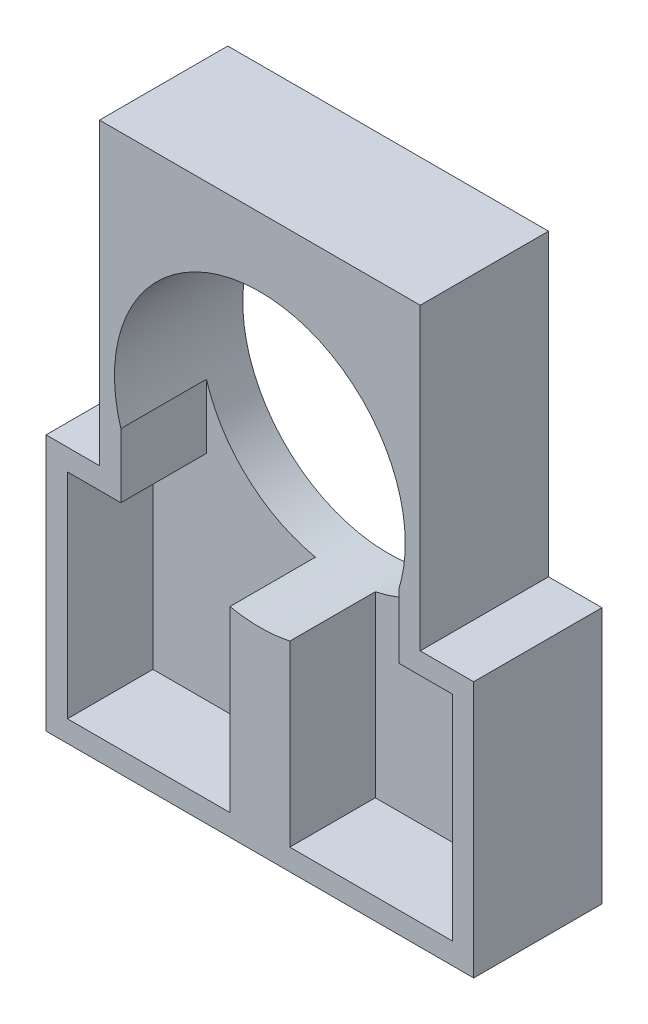
ISO-10303-21;
HEADER;
FILE_DESCRIPTION(('STEP AP214'),'2;1');
FILE_NAME('part.step','',(''),(''),'','','');
FILE_SCHEMA(('AUTOMOTIVE_DESIGN { 1 0 10303 214 1 1 1 1 }'));
ENDSEC;
DATA;
#1=APPLICATION_CONTEXT('core data for automotive mechanical design processes');
#2=APPLICATION_PROTOCOL_DEFINITION('international standard','automotive_design',2000,#1);
#3=PRODUCT_CONTEXT('',#1,'mechanical');
#4=PRODUCT('Part','Part','',(#3));
#5=PRODUCT_RELATED_PRODUCT_CATEGORY('part','',(#4));
#6=PRODUCT_DEFINITION_FORMATION('','',#4);
#7=PRODUCT_DEFINITION_CONTEXT('part definition',#1,'design');
#8=PRODUCT_DEFINITION('design','',#6,#7);
#9=PRODUCT_DEFINITION_SHAPE('','',#8);
#10=(LENGTH_UNIT() NAMED_UNIT(*) SI_UNIT(.MILLI.,.METRE.));
#11=(NAMED_UNIT(*) PLANE_ANGLE_UNIT() SI_UNIT($,.RADIAN.));
#12=(NAMED_UNIT(*) SI_UNIT($,.STERADIAN.) SOLID_ANGLE_UNIT());
#13=UNCERTAINTY_MEASURE_WITH_UNIT(LENGTH_MEASURE(1.E-05),#10,'distance_accuracy_value','');
#14=(GEOMETRIC_REPRESENTATION_CONTEXT(3) GLOBAL_UNCERTAINTY_ASSIGNED_CONTEXT((#13)) GLOBAL_UNIT_ASSIGNED_CONTEXT((#10,
#11,#12)) REPRESENTATION_CONTEXT('',''));
#15=CARTESIAN_POINT('',(0.,0.,0.));
#16=DIRECTION('',(0.,0.,1.));
#17=DIRECTION('',(1.,0.,0.));
#18=AXIS2_PLACEMENT_3D('',#15,#16,#17);
#19=CARTESIAN_POINT('',(0.,0.,30.));
#20=DIRECTION('',(0.,0.,1.));
#21=DIRECTION('',(1.,0.,0.));
#22=AXIS2_PLACEMENT_3D('',#19,#20,#21);
#23=PLANE('',#22);
#24=DIRECTION('',(-1.,0.,0.));
#25=VECTOR('',#24,1.);
#26=CARTESIAN_POINT('',(37.5,30.,30.));
#27=LINE('',#26,#25);
#28=CARTESIAN_POINT('',(50.,30.,30.));
#29=VERTEX_POINT('',#28);
#30=CARTESIAN_POINT('',(37.5,30.,30.));
#31=VERTEX_POINT('',#30);
#32=EDGE_CURVE('E251',#29,#31,#27,.T.);
#33=ORIENTED_EDGE('',*,*,#32,.T.);
#34=DIRECTION('',(0.,1.,0.));
#35=VECTOR('',#34,1.);
#36=CARTESIAN_POINT('',(37.5,100.,30.));
#37=LINE('',#36,#35);
#38=CARTESIAN_POINT('',(37.5,100.,30.));
#39=VERTEX_POINT('',#38);
#40=EDGE_CURVE('E254',#31,#39,#37,.T.);
#41=ORIENTED_EDGE('',*,*,#40,.T.);
#42=DIRECTION('',(-1.,0.,0.));
#43=VECTOR('',#42,1.);
#44=CARTESIAN_POINT('',(-37.5,100.,30.));
#45=LINE('',#44,#43);
#46=CARTESIAN_POINT('',(-37.5,100.,30.));
#47=VERTEX_POINT('',#46);
#48=EDGE_CURVE('E257',#39,#47,#45,.T.);
#49=ORIENTED_EDGE('',*,*,#48,.T.);
#50=DIRECTION('',(0.,-1.,0.));
#51=VECTOR('',#50,1.);
#52=CARTESIAN_POINT('',(-37.5,100.,30.));
#53=LINE('',#52,#51);
#54=CARTESIAN_POINT('',(-37.5,30.,30.));
#55=VERTEX_POINT('',#54);
#56=EDGE_CURVE('E259',#47,#55,#53,.T.);
#57=ORIENTED_EDGE('',*,*,#56,.T.);
#58=DIRECTION('',(-1.,0.,0.));
#59=VECTOR('',#58,1.);
#60=CARTESIAN_POINT('',(-50.,30.,30.));
#61=LINE('',#60,#59);
#62=CARTESIAN_POINT('',(-50.,30.,30.));
#63=VERTEX_POINT('',#62);
#64=EDGE_CURVE('E261',#55,#63,#61,.T.);
#65=ORIENTED_EDGE('',*,*,#64,.T.);
#66=DIRECTION('',(0.,-1.,0.));
#67=VECTOR('',#66,1.);
#68=CARTESIAN_POINT('',(-50.,-30.,30.));
#69=LINE('',#68,#67);
#70=CARTESIAN_POINT('',(-50.,-30.,30.));
#71=VERTEX_POINT('',#70);
#72=EDGE_CURVE('E263',#63,#71,#69,.T.);
#73=ORIENTED_EDGE('',*,*,#72,.T.);
#74=DIRECTION('',(1.,0.,0.));
#75=VECTOR('',#74,1.);
#76=CARTESIAN_POINT('',(-50.,-30.,30.));
#77=LINE('',#76,#75);
#78=CARTESIAN_POINT('',(50.,-30.,30.));
#79=VERTEX_POINT('',#78);
#80=EDGE_CURVE('E265',#71,#79,#77,.T.);
#81=ORIENTED_EDGE('',*,*,#80,.T.);
#82=DIRECTION('',(0.,1.,0.));
#83=VECTOR('',#82,1.);
#84=CARTESIAN_POINT('',(50.,-30.,30.));
#85=LINE('',#84,#83);
#86=EDGE_CURVE('E267',#79,#29,#85,.T.);
#87=ORIENTED_EDGE('',*,*,#86,.T.);
#88=EDGE_LOOP('',(#33,#41,#49,#57,#65,#73,#81,#87));
#89=FACE_BOUND('',#88,.T.);
#90=CARTESIAN_POINT('',(0.,50.,30.));
#91=DIRECTION('',(0.,0.,1.));
#92=DIRECTION('',(1.,0.,0.));
#93=AXIS2_PLACEMENT_3D('',#90,#91,#92);
#94=CIRCLE('',#93,34.);
#95=CARTESIAN_POINT('',(32.5,40.0125078222809,30.));
#96=VERTEX_POINT('',#95);
#97=CARTESIAN_POINT('',(-32.5,40.0125078222809,30.));
#98=VERTEX_POINT('',#97);
#99=EDGE_CURVE('E235',#96,#98,#94,.T.);
#100=ORIENTED_EDGE('',*,*,#99,.F.);
#101=DIRECTION('',(0.,-1.,0.));
#102=VECTOR('',#101,1.);
#103=CARTESIAN_POINT('',(32.5,25.,30.));
#104=LINE('',#103,#102);
#105=CARTESIAN_POINT('',(32.5,25.,30.));
#106=VERTEX_POINT('',#105);
#107=EDGE_CURVE('E190',#96,#106,#104,.T.);
#108=ORIENTED_EDGE('',*,*,#107,.T.);
#109=DIRECTION('',(1.,0.,0.));
#110=VECTOR('',#109,1.);
#111=CARTESIAN_POINT('',(45.,25.,30.));
#112=LINE('',#111,#110);
#113=CARTESIAN_POINT('',(45.,25.,30.));
#114=VERTEX_POINT('',#113);
#115=EDGE_CURVE('E558',#106,#114,#112,.T.);
#116=ORIENTED_EDGE('',*,*,#115,.T.);
#117=DIRECTION('',(0.,-1.,0.));
#118=VECTOR('',#117,1.);
#119=CARTESIAN_POINT('',(45.,-25.,30.));
#120=LINE('',#119,#118);
#121=CARTESIAN_POINT('',(45.,-25.,30.));
#122=VERTEX_POINT('',#121);
#123=EDGE_CURVE('E550',#114,#122,#120,.T.);
#124=ORIENTED_EDGE('',*,*,#123,.T.);
#125=DIRECTION('',(-1.,0.,0.));
#126=VECTOR('',#125,1.);
#127=CARTESIAN_POINT('',(45.,-25.,30.));
#128=LINE('',#127,#126);
#129=CARTESIAN_POINT('',(7.00000000000001,-25.,30.));
#130=VERTEX_POINT('',#129);
#131=EDGE_CURVE('E548',#122,#130,#128,.T.);
#132=ORIENTED_EDGE('',*,*,#131,.T.);
#133=DIRECTION('',(0.,1.,0.));
#134=VECTOR('',#133,1.);
#135=CARTESIAN_POINT('',(7.00000000000001,-25.,30.));
#136=LINE('',#135,#134);
#137=CARTESIAN_POINT('',(7.00000000000001,16.7283904807718,30.));
#138=VERTEX_POINT('',#137);
#139=EDGE_CURVE('E551',#130,#138,#136,.T.);
#140=ORIENTED_EDGE('',*,*,#139,.T.);
#141=CARTESIAN_POINT('',(-7.00000000000001,16.7283904807718,30.));
#142=VERTEX_POINT('',#141);
#143=EDGE_CURVE('E196',#142,#138,#94,.T.);
#144=ORIENTED_EDGE('',*,*,#143,.F.);
#145=DIRECTION('',(0.,1.,0.));
#146=VECTOR('',#145,1.);
#147=CARTESIAN_POINT('',(-7.00000000000001,-25.,30.));
#148=LINE('',#147,#146);
#149=CARTESIAN_POINT('',(-7.00000000000001,-25.,30.));
#150=VERTEX_POINT('',#149);
#151=EDGE_CURVE('E207',#150,#142,#148,.T.);
#152=ORIENTED_EDGE('',*,*,#151,.F.);
#153=DIRECTION('',(1.,0.,0.));
#154=VECTOR('',#153,1.);
#155=CARTESIAN_POINT('',(-45.,-25.,30.));
#156=LINE('',#155,#154);
#157=CARTESIAN_POINT('',(-45.,-25.,30.));
#158=VERTEX_POINT('',#157);
#159=EDGE_CURVE('E229',#158,#150,#156,.T.);
#160=ORIENTED_EDGE('',*,*,#159,.F.);
#161=DIRECTION('',(0.,-1.,0.));
#162=VECTOR('',#161,1.);
#163=CARTESIAN_POINT('',(-45.,-25.,30.));
#164=LINE('',#163,#162);
#165=CARTESIAN_POINT('',(-45.,25.,30.));
#166=VERTEX_POINT('',#165);
#167=EDGE_CURVE('E226',#166,#158,#164,.T.);
#168=ORIENTED_EDGE('',*,*,#167,.F.);
#169=DIRECTION('',(-1.,0.,0.));
#170=VECTOR('',#169,1.);
#171=CARTESIAN_POINT('',(-45.,25.,30.));
#172=LINE('',#171,#170);
#173=CARTESIAN_POINT('',(-32.5,25.,30.));
#174=VERTEX_POINT('',#173);
#175=EDGE_CURVE('E223',#174,#166,#172,.T.);
#176=ORIENTED_EDGE('',*,*,#175,.F.);
#177=DIRECTION('',(0.,-1.,0.));
#178=VECTOR('',#177,1.);
#179=CARTESIAN_POINT('',(-32.5,25.,30.));
#180=LINE('',#179,#178);
#181=EDGE_CURVE('E220',#98,#174,#180,.T.);
#182=ORIENTED_EDGE('',*,*,#181,.F.);
#183=EDGE_LOOP('',(#100,#108,#116,#124,#132,#140,#144,#152,#160,#168,#176,#182));
#184=FACE_BOUND('',#183,.T.);
#185=ADVANCED_FACE('F33',(#89,#184),#23,.T.);
#186=CARTESIAN_POINT('',(0.,50.,0.));
#187=DIRECTION('',(0.,0.,1.));
#188=DIRECTION('',(1.,0.,0.));
#189=AXIS2_PLACEMENT_3D('',#186,#187,#188);
#190=CYLINDRICAL_SURFACE('',#189,34.);
#191=CARTESIAN_POINT('',(0.,50.,0.));
#192=DIRECTION('',(0.,0.,1.));
#193=DIRECTION('',(1.,0.,0.));
#194=AXIS2_PLACEMENT_3D('',#191,#192,#193);
#195=CIRCLE('',#194,34.);
#196=CARTESIAN_POINT('',(34.,50.,0.));
#197=VERTEX_POINT('',#196);
#198=EDGE_CURVE('E246',#197,#197,#195,.T.);
#199=ORIENTED_EDGE('',*,*,#198,.F.);
#200=EDGE_LOOP('',(#199));
#201=FACE_BOUND('',#200,.T.);
#202=DIRECTION('',(0.,0.,1.));
#203=VECTOR('',#202,1.);
#204=CARTESIAN_POINT('',(32.5,40.0125078222809,10.));
#205=LINE('',#204,#203);
#206=CARTESIAN_POINT('',(32.5,40.0125078222809,10.));
#207=VERTEX_POINT('',#206);
#208=EDGE_CURVE('E48',#207,#96,#205,.T.);
#209=ORIENTED_EDGE('',*,*,#208,.T.);
#210=ORIENTED_EDGE('',*,*,#99,.T.);
#211=DIRECTION('',(0.,0.,1.));
#212=VECTOR('',#211,1.);
#213=CARTESIAN_POINT('',(-32.5,40.0125078222809,10.));
#214=LINE('',#213,#212);
#215=CARTESIAN_POINT('',(-32.5,40.0125078222809,10.));
#216=VERTEX_POINT('',#215);
#217=EDGE_CURVE('E219',#216,#98,#214,.T.);
#218=ORIENTED_EDGE('',*,*,#217,.F.);
#219=CARTESIAN_POINT('',(0.,50.,10.));
#220=DIRECTION('',(0.,0.,-1.));
#221=DIRECTION('',(1.,0.,0.));
#222=AXIS2_PLACEMENT_3D('',#219,#220,#221);
#223=CIRCLE('',#222,34.);
#224=CARTESIAN_POINT('',(-7.00000000000001,16.7283904807718,10.));
#225=VERTEX_POINT('',#224);
#226=EDGE_CURVE('E204',#225,#216,#223,.T.);
#227=ORIENTED_EDGE('',*,*,#226,.F.);
#228=DIRECTION('',(0.,0.,1.));
#229=VECTOR('',#228,1.);
#230=CARTESIAN_POINT('',(-7.00000000000001,16.7283904807718,10.));
#231=LINE('',#230,#229);
#232=EDGE_CURVE('E233',#225,#142,#231,.T.);
#233=ORIENTED_EDGE('',*,*,#232,.T.);
#234=ORIENTED_EDGE('',*,*,#143,.T.);
#235=DIRECTION('',(0.,0.,1.));
#236=VECTOR('',#235,1.);
#237=CARTESIAN_POINT('',(7.00000000000001,16.7283904807718,10.));
#238=LINE('',#237,#236);
#239=CARTESIAN_POINT('',(7.00000000000001,16.7283904807718,10.));
#240=VERTEX_POINT('',#239);
#241=EDGE_CURVE('E177',#240,#138,#238,.T.);
#242=ORIENTED_EDGE('',*,*,#241,.F.);
#243=CARTESIAN_POINT('',(0.,50.,10.));
#244=DIRECTION('',(0.,0.,1.));
#245=DIRECTION('',(-1.,0.,0.));
#246=AXIS2_PLACEMENT_3D('',#243,#244,#245);
#247=CIRCLE('',#246,34.);
#248=EDGE_CURVE('E183',#240,#207,#247,.T.);
#249=ORIENTED_EDGE('',*,*,#248,.T.);
#250=EDGE_LOOP('',(#209,#210,#218,#227,#233,#234,#242,#249));
#251=FACE_BOUND('',#250,.T.);
#252=ADVANCED_FACE('F193',(#201,#251),#190,.F.);
#253=CARTESIAN_POINT('',(37.5,30.,30.));
#254=DIRECTION('',(0.,-1.,0.));
#255=DIRECTION('',(0.,0.,-1.));
#256=AXIS2_PLACEMENT_3D('',#253,#254,#255);
#257=PLANE('',#256);
#258=DIRECTION('',(-1.,0.,0.));
#259=VECTOR('',#258,1.);
#260=CARTESIAN_POINT('',(37.5,30.,0.));
#261=LINE('',#260,#259);
#262=CARTESIAN_POINT('',(50.,30.,0.));
#263=VERTEX_POINT('',#262);
#264=CARTESIAN_POINT('',(37.5,30.,0.));
#265=VERTEX_POINT('',#264);
#266=EDGE_CURVE('E249',#263,#265,#261,.T.);
#267=ORIENTED_EDGE('',*,*,#266,.T.);
#268=DIRECTION('',(0.,0.,-1.));
#269=VECTOR('',#268,1.);
#270=CARTESIAN_POINT('',(37.5,30.,30.));
#271=LINE('',#270,#269);
#272=EDGE_CURVE('E11',#31,#265,#271,.T.);
#273=ORIENTED_EDGE('',*,*,#272,.F.);
#274=ORIENTED_EDGE('',*,*,#32,.F.);
#275=DIRECTION('',(0.,0.,-1.));
#276=VECTOR('',#275,1.);
#277=CARTESIAN_POINT('',(50.,30.,30.));
#278=LINE('',#277,#276);
#279=EDGE_CURVE('E269',#29,#263,#278,.T.);
#280=ORIENTED_EDGE('',*,*,#279,.T.);
#281=EDGE_LOOP('',(#267,#273,#274,#280));
#282=FACE_BOUND('',#281,.T.);
#283=ADVANCED_FACE('F35',(#282),#257,.F.);
#284=CARTESIAN_POINT('',(37.5,100.,30.));
#285=DIRECTION('',(-1.,0.,0.));
#286=DIRECTION('',(0.,-1.,0.));
#287=AXIS2_PLACEMENT_3D('',#284,#285,#286);
#288=PLANE('',#287);
#289=DIRECTION('',(0.,1.,0.));
#290=VECTOR('',#289,1.);
#291=CARTESIAN_POINT('',(37.5,100.,0.));
#292=LINE('',#291,#290);
#293=CARTESIAN_POINT('',(37.5,100.,0.));
#294=VERTEX_POINT('',#293);
#295=EDGE_CURVE('E272',#265,#294,#292,.T.);
#296=ORIENTED_EDGE('',*,*,#295,.T.);
#297=DIRECTION('',(0.,0.,-1.));
#298=VECTOR('',#297,1.);
#299=CARTESIAN_POINT('',(37.5,100.,30.));
#300=LINE('',#299,#298);
#301=EDGE_CURVE('E41',#39,#294,#300,.T.);
#302=ORIENTED_EDGE('',*,*,#301,.F.);
#303=ORIENTED_EDGE('',*,*,#40,.F.);
#304=ORIENTED_EDGE('',*,*,#272,.T.);
#305=EDGE_LOOP('',(#296,#302,#303,#304));
#306=FACE_BOUND('',#305,.T.);
#307=ADVANCED_FACE('F329',(#306),#288,.F.);
#308=CARTESIAN_POINT('',(-37.5,100.,30.));
#309=DIRECTION('',(0.,-1.,0.));
#310=DIRECTION('',(0.,0.,-1.));
#311=AXIS2_PLACEMENT_3D('',#308,#309,#310);
#312=PLANE('',#311);
#313=DIRECTION('',(-1.,0.,0.));
#314=VECTOR('',#313,1.);
#315=CARTESIAN_POINT('',(-37.5,100.,0.));
#316=LINE('',#315,#314);
#317=CARTESIAN_POINT('',(-37.5,100.,0.));
#318=VERTEX_POINT('',#317);
#319=EDGE_CURVE('E274',#294,#318,#316,.T.);
#320=ORIENTED_EDGE('',*,*,#319,.T.);
#321=DIRECTION('',(0.,0.,-1.));
#322=VECTOR('',#321,1.);
#323=CARTESIAN_POINT('',(-37.5,100.,30.));
#324=LINE('',#323,#322);
#325=EDGE_CURVE('E299',#47,#318,#324,.T.);
#326=ORIENTED_EDGE('',*,*,#325,.F.);
#327=ORIENTED_EDGE('',*,*,#48,.F.);
#328=ORIENTED_EDGE('',*,*,#301,.T.);
#329=EDGE_LOOP('',(#320,#326,#327,#328));
#330=FACE_BOUND('',#329,.T.);
#331=ADVANCED_FACE('F306',(#330),#312,.F.);
#332=CARTESIAN_POINT('',(-37.5,100.,30.));
#333=DIRECTION('',(1.,0.,0.));
#334=DIRECTION('',(0.,1.,0.));
#335=AXIS2_PLACEMENT_3D('',#332,#333,#334);
#336=PLANE('',#335);
#337=DIRECTION('',(0.,-1.,0.));
#338=VECTOR('',#337,1.);
#339=CARTESIAN_POINT('',(-37.5,100.,0.));
#340=LINE('',#339,#338);
#341=CARTESIAN_POINT('',(-37.5,30.,0.));
#342=VERTEX_POINT('',#341);
#343=EDGE_CURVE('E276',#318,#342,#340,.T.);
#344=ORIENTED_EDGE('',*,*,#343,.T.);
#345=DIRECTION('',(0.,0.,-1.));
#346=VECTOR('',#345,1.);
#347=CARTESIAN_POINT('',(-37.5,30.,30.));
#348=LINE('',#347,#346);
#349=EDGE_CURVE('E296',#55,#342,#348,.T.);
#350=ORIENTED_EDGE('',*,*,#349,.F.);
#351=ORIENTED_EDGE('',*,*,#56,.F.);
#352=ORIENTED_EDGE('',*,*,#325,.T.);
#353=EDGE_LOOP('',(#344,#350,#351,#352));
#354=FACE_BOUND('',#353,.T.);
#355=ADVANCED_FACE('F317',(#354),#336,.F.);
#356=CARTESIAN_POINT('',(-50.,30.,30.));
#357=DIRECTION('',(0.,-1.,0.));
#358=DIRECTION('',(0.,0.,-1.));
#359=AXIS2_PLACEMENT_3D('',#356,#357,#358);
#360=PLANE('',#359);
#361=DIRECTION('',(-1.,0.,0.));
#362=VECTOR('',#361,1.);
#363=CARTESIAN_POINT('',(-50.,30.,0.));
#364=LINE('',#363,#362);
#365=CARTESIAN_POINT('',(-50.,30.,0.));
#366=VERTEX_POINT('',#365);
#367=EDGE_CURVE('E278',#342,#366,#364,.T.);
#368=ORIENTED_EDGE('',*,*,#367,.T.);
#369=DIRECTION('',(0.,0.,-1.));
#370=VECTOR('',#369,1.);
#371=CARTESIAN_POINT('',(-50.,30.,30.));
#372=LINE('',#371,#370);
#373=EDGE_CURVE('E293',#63,#366,#372,.T.);
#374=ORIENTED_EDGE('',*,*,#373,.F.);
#375=ORIENTED_EDGE('',*,*,#64,.F.);
#376=ORIENTED_EDGE('',*,*,#349,.T.);
#377=EDGE_LOOP('',(#368,#374,#375,#376));
#378=FACE_BOUND('',#377,.T.);
#379=ADVANCED_FACE('F321',(#378),#360,.F.);
#380=CARTESIAN_POINT('',(-50.,-30.,30.));
#381=DIRECTION('',(1.,0.,0.));
#382=DIRECTION('',(0.,0.,-1.));
#383=AXIS2_PLACEMENT_3D('',#380,#381,#382);
#384=PLANE('',#383);
#385=DIRECTION('',(0.,-1.,0.));
#386=VECTOR('',#385,1.);
#387=CARTESIAN_POINT('',(-50.,-30.,0.));
#388=LINE('',#387,#386);
#389=CARTESIAN_POINT('',(-50.,-30.,0.));
#390=VERTEX_POINT('',#389);
#391=EDGE_CURVE('E280',#366,#390,#388,.T.);
#392=ORIENTED_EDGE('',*,*,#391,.T.);
#393=DIRECTION('',(0.,0.,-1.));
#394=VECTOR('',#393,1.);
#395=CARTESIAN_POINT('',(-50.,-30.,30.));
#396=LINE('',#395,#394);
#397=EDGE_CURVE('E290',#71,#390,#396,.T.);
#398=ORIENTED_EDGE('',*,*,#397,.F.);
#399=ORIENTED_EDGE('',*,*,#72,.F.);
#400=ORIENTED_EDGE('',*,*,#373,.T.);
#401=EDGE_LOOP('',(#392,#398,#399,#400));
#402=FACE_BOUND('',#401,.T.);
#403=ADVANCED_FACE('F342',(#402),#384,.F.);
#404=CARTESIAN_POINT('',(-50.,-30.,30.));
#405=DIRECTION('',(0.,1.,0.));
#406=DIRECTION('',(0.,0.,1.));
#407=AXIS2_PLACEMENT_3D('',#404,#405,#406);
#408=PLANE('',#407);
#409=DIRECTION('',(1.,0.,0.));
#410=VECTOR('',#409,1.);
#411=CARTESIAN_POINT('',(-50.,-30.,0.));
#412=LINE('',#411,#410);
#413=CARTESIAN_POINT('',(50.,-30.,0.));
#414=VERTEX_POINT('',#413);
#415=EDGE_CURVE('E282',#390,#414,#412,.T.);
#416=ORIENTED_EDGE('',*,*,#415,.T.);
#417=DIRECTION('',(0.,0.,-1.));
#418=VECTOR('',#417,1.);
#419=CARTESIAN_POINT('',(50.,-30.,30.));
#420=LINE('',#419,#418);
#421=EDGE_CURVE('E287',#79,#414,#420,.T.);
#422=ORIENTED_EDGE('',*,*,#421,.F.);
#423=ORIENTED_EDGE('',*,*,#80,.F.);
#424=ORIENTED_EDGE('',*,*,#397,.T.);
#425=EDGE_LOOP('',(#416,#422,#423,#424));
#426=FACE_BOUND('',#425,.T.);
#427=ADVANCED_FACE('F340',(#426),#408,.F.);
#428=CARTESIAN_POINT('',(50.,-30.,30.));
#429=DIRECTION('',(-1.,0.,0.));
#430=DIRECTION('',(0.,0.,1.));
#431=AXIS2_PLACEMENT_3D('',#428,#429,#430);
#432=PLANE('',#431);
#433=DIRECTION('',(0.,1.,0.));
#434=VECTOR('',#433,1.);
#435=CARTESIAN_POINT('',(50.,-30.,0.));
#436=LINE('',#435,#434);
#437=EDGE_CURVE('E255',#414,#263,#436,.T.);
#438=ORIENTED_EDGE('',*,*,#437,.T.);
#439=ORIENTED_EDGE('',*,*,#279,.F.);
#440=ORIENTED_EDGE('',*,*,#86,.F.);
#441=ORIENTED_EDGE('',*,*,#421,.T.);
#442=EDGE_LOOP('',(#438,#439,#440,#441));
#443=FACE_BOUND('',#442,.T.);
#444=ADVANCED_FACE('F335',(#443),#432,.F.);
#445=CARTESIAN_POINT('',(0.,0.,0.));
#446=DIRECTION('',(0.,0.,1.));
#447=DIRECTION('',(1.,0.,0.));
#448=AXIS2_PLACEMENT_3D('',#445,#446,#447);
#449=PLANE('',#448);
#450=ORIENTED_EDGE('',*,*,#198,.T.);
#451=EDGE_LOOP('',(#450));
#452=FACE_BOUND('',#451,.T.);
#453=ORIENTED_EDGE('',*,*,#266,.F.);
#454=ORIENTED_EDGE('',*,*,#437,.F.);
#455=ORIENTED_EDGE('',*,*,#415,.F.);
#456=ORIENTED_EDGE('',*,*,#391,.F.);
#457=ORIENTED_EDGE('',*,*,#367,.F.);
#458=ORIENTED_EDGE('',*,*,#343,.F.);
#459=ORIENTED_EDGE('',*,*,#319,.F.);
#460=ORIENTED_EDGE('',*,*,#295,.F.);
#461=EDGE_LOOP('',(#453,#454,#455,#456,#457,#458,#459,#460));
#462=FACE_BOUND('',#461,.T.);
#463=ADVANCED_FACE('F312',(#452,#462),#449,.F.);
#464=CARTESIAN_POINT('',(-7.00000000000001,-25.,10.));
#465=DIRECTION('',(1.,0.,0.));
#466=DIRECTION('',(0.,0.,-1.));
#467=AXIS2_PLACEMENT_3D('',#464,#465,#466);
#468=PLANE('',#467);
#469=ORIENTED_EDGE('',*,*,#151,.T.);
#470=ORIENTED_EDGE('',*,*,#232,.F.);
#471=DIRECTION('',(0.,1.,0.));
#472=VECTOR('',#471,1.);
#473=CARTESIAN_POINT('',(-7.00000000000001,-25.,10.));
#474=LINE('',#473,#472);
#475=CARTESIAN_POINT('',(-7.00000000000001,-25.,10.));
#476=VERTEX_POINT('',#475);
#477=EDGE_CURVE('E56',#476,#225,#474,.T.);
#478=ORIENTED_EDGE('',*,*,#477,.F.);
#479=DIRECTION('',(0.,0.,1.));
#480=VECTOR('',#479,1.);
#481=CARTESIAN_POINT('',(-7.00000000000001,-25.,10.));
#482=LINE('',#481,#480);
#483=EDGE_CURVE('E236',#476,#150,#482,.T.);
#484=ORIENTED_EDGE('',*,*,#483,.T.);
#485=EDGE_LOOP('',(#469,#470,#478,#484));
#486=FACE_BOUND('',#485,.T.);
#487=ADVANCED_FACE('F362',(#486),#468,.F.);
#488=CARTESIAN_POINT('',(-45.,-25.,10.));
#489=DIRECTION('',(0.,-1.,0.));
#490=DIRECTION('',(0.,0.,-1.));
#491=AXIS2_PLACEMENT_3D('',#488,#489,#490);
#492=PLANE('',#491);
#493=ORIENTED_EDGE('',*,*,#159,.T.);
#494=ORIENTED_EDGE('',*,*,#483,.F.);
#495=DIRECTION('',(1.,0.,0.));
#496=VECTOR('',#495,1.);
#497=CARTESIAN_POINT('',(-45.,-25.,10.));
#498=LINE('',#497,#496);
#499=CARTESIAN_POINT('',(-45.,-25.,10.));
#500=VERTEX_POINT('',#499);
#501=EDGE_CURVE('E216',#500,#476,#498,.T.);
#502=ORIENTED_EDGE('',*,*,#501,.F.);
#503=DIRECTION('',(0.,0.,1.));
#504=VECTOR('',#503,1.);
#505=CARTESIAN_POINT('',(-45.,-25.,10.));
#506=LINE('',#505,#504);
#507=EDGE_CURVE('E238',#500,#158,#506,.T.);
#508=ORIENTED_EDGE('',*,*,#507,.T.);
#509=EDGE_LOOP('',(#493,#494,#502,#508));
#510=FACE_BOUND('',#509,.T.);
#511=ADVANCED_FACE('F379',(#510),#492,.F.);
#512=CARTESIAN_POINT('',(-45.,-25.,10.));
#513=DIRECTION('',(-1.,0.,0.));
#514=DIRECTION('',(0.,0.,1.));
#515=AXIS2_PLACEMENT_3D('',#512,#513,#514);
#516=PLANE('',#515);
#517=ORIENTED_EDGE('',*,*,#167,.T.);
#518=ORIENTED_EDGE('',*,*,#507,.F.);
#519=DIRECTION('',(0.,-1.,0.));
#520=VECTOR('',#519,1.);
#521=CARTESIAN_POINT('',(-45.,-25.,10.));
#522=LINE('',#521,#520);
#523=CARTESIAN_POINT('',(-45.,25.,10.));
#524=VERTEX_POINT('',#523);
#525=EDGE_CURVE('E213',#524,#500,#522,.T.);
#526=ORIENTED_EDGE('',*,*,#525,.F.);
#527=DIRECTION('',(0.,0.,1.));
#528=VECTOR('',#527,1.);
#529=CARTESIAN_POINT('',(-45.,25.,10.));
#530=LINE('',#529,#528);
#531=EDGE_CURVE('E240',#524,#166,#530,.T.);
#532=ORIENTED_EDGE('',*,*,#531,.T.);
#533=EDGE_LOOP('',(#517,#518,#526,#532));
#534=FACE_BOUND('',#533,.T.);
#535=ADVANCED_FACE('F387',(#534),#516,.F.);
#536=CARTESIAN_POINT('',(-45.,25.,10.));
#537=DIRECTION('',(0.,1.,0.));
#538=DIRECTION('',(0.,0.,1.));
#539=AXIS2_PLACEMENT_3D('',#536,#537,#538);
#540=PLANE('',#539);
#541=ORIENTED_EDGE('',*,*,#175,.T.);
#542=ORIENTED_EDGE('',*,*,#531,.F.);
#543=DIRECTION('',(-1.,0.,0.));
#544=VECTOR('',#543,1.);
#545=CARTESIAN_POINT('',(-45.,25.,10.));
#546=LINE('',#545,#544);
#547=CARTESIAN_POINT('',(-32.5,25.,10.));
#548=VERTEX_POINT('',#547);
#549=EDGE_CURVE('E210',#548,#524,#546,.T.);
#550=ORIENTED_EDGE('',*,*,#549,.F.);
#551=DIRECTION('',(0.,0.,1.));
#552=VECTOR('',#551,1.);
#553=CARTESIAN_POINT('',(-32.5,25.,10.));
#554=LINE('',#553,#552);
#555=EDGE_CURVE('E242',#548,#174,#554,.T.);
#556=ORIENTED_EDGE('',*,*,#555,.T.);
#557=EDGE_LOOP('',(#541,#542,#550,#556));
#558=FACE_BOUND('',#557,.T.);
#559=ADVANCED_FACE('F395',(#558),#540,.F.);
#560=CARTESIAN_POINT('',(-32.5,25.,10.));
#561=DIRECTION('',(-1.,0.,0.));
#562=DIRECTION('',(0.,-1.,0.));
#563=AXIS2_PLACEMENT_3D('',#560,#561,#562);
#564=PLANE('',#563);
#565=ORIENTED_EDGE('',*,*,#181,.T.);
#566=ORIENTED_EDGE('',*,*,#555,.F.);
#567=DIRECTION('',(0.,-1.,0.));
#568=VECTOR('',#567,1.);
#569=CARTESIAN_POINT('',(-32.5,25.,10.));
#570=LINE('',#569,#568);
#571=EDGE_CURVE('E206',#216,#548,#570,.T.);
#572=ORIENTED_EDGE('',*,*,#571,.F.);
#573=ORIENTED_EDGE('',*,*,#217,.T.);
#574=EDGE_LOOP('',(#565,#566,#572,#573));
#575=FACE_BOUND('',#574,.T.);
#576=ADVANCED_FACE('F403',(#575),#564,.F.);
#577=CARTESIAN_POINT('',(0.,50.,10.));
#578=DIRECTION('',(0.,0.,1.));
#579=DIRECTION('',(1.,0.,0.));
#580=AXIS2_PLACEMENT_3D('',#577,#578,#579);
#581=PLANE('',#580);
#582=ORIENTED_EDGE('',*,*,#226,.T.);
#583=ORIENTED_EDGE('',*,*,#571,.T.);
#584=ORIENTED_EDGE('',*,*,#549,.T.);
#585=ORIENTED_EDGE('',*,*,#525,.T.);
#586=ORIENTED_EDGE('',*,*,#501,.T.);
#587=ORIENTED_EDGE('',*,*,#477,.T.);
#588=EDGE_LOOP('',(#582,#583,#584,#585,#586,#587));
#589=FACE_BOUND('',#588,.T.);
#590=ADVANCED_FACE('F411',(#589),#581,.T.);
#591=CARTESIAN_POINT('',(32.5,25.,10.));
#592=DIRECTION('',(-1.,0.,0.));
#593=DIRECTION('',(0.,-1.,0.));
#594=AXIS2_PLACEMENT_3D('',#591,#592,#593);
#595=PLANE('',#594);
#596=ORIENTED_EDGE('',*,*,#107,.F.);
#597=ORIENTED_EDGE('',*,*,#208,.F.);
#598=DIRECTION('',(0.,-1.,0.));
#599=VECTOR('',#598,1.);
#600=CARTESIAN_POINT('',(32.5,25.,10.));
#601=LINE('',#600,#599);
#602=CARTESIAN_POINT('',(32.5,25.,10.));
#603=VERTEX_POINT('',#602);
#604=EDGE_CURVE('E188',#207,#603,#601,.T.);
#605=ORIENTED_EDGE('',*,*,#604,.T.);
#606=DIRECTION('',(0.,0.,1.));
#607=VECTOR('',#606,1.);
#608=CARTESIAN_POINT('',(32.5,25.,10.));
#609=LINE('',#608,#607);
#610=EDGE_CURVE('E566',#603,#106,#609,.T.);
#611=ORIENTED_EDGE('',*,*,#610,.T.);
#612=EDGE_LOOP('',(#596,#597,#605,#611));
#613=FACE_BOUND('',#612,.T.);
#614=ADVANCED_FACE('F418',(#613),#595,.T.);
#615=CARTESIAN_POINT('',(45.,25.,10.));
#616=DIRECTION('',(0.,-1.,0.));
#617=DIRECTION('',(0.,0.,-1.));
#618=AXIS2_PLACEMENT_3D('',#615,#616,#617);
#619=PLANE('',#618);
#620=ORIENTED_EDGE('',*,*,#115,.F.);
#621=ORIENTED_EDGE('',*,*,#610,.F.);
#622=DIRECTION('',(1.,0.,0.));
#623=VECTOR('',#622,1.);
#624=CARTESIAN_POINT('',(45.,25.,10.));
#625=LINE('',#624,#623);
#626=CARTESIAN_POINT('',(45.,25.,10.));
#627=VERTEX_POINT('',#626);
#628=EDGE_CURVE('E200',#603,#627,#625,.T.);
#629=ORIENTED_EDGE('',*,*,#628,.T.);
#630=DIRECTION('',(0.,0.,1.));
#631=VECTOR('',#630,1.);
#632=CARTESIAN_POINT('',(45.,25.,10.));
#633=LINE('',#632,#631);
#634=EDGE_CURVE('E568',#627,#114,#633,.T.);
#635=ORIENTED_EDGE('',*,*,#634,.T.);
#636=EDGE_LOOP('',(#620,#621,#629,#635));
#637=FACE_BOUND('',#636,.T.);
#638=ADVANCED_FACE('F425',(#637),#619,.T.);
#639=CARTESIAN_POINT('',(45.,-25.,10.));
#640=DIRECTION('',(-1.,0.,0.));
#641=DIRECTION('',(0.,0.,1.));
#642=AXIS2_PLACEMENT_3D('',#639,#640,#641);
#643=PLANE('',#642);
#644=ORIENTED_EDGE('',*,*,#123,.F.);
#645=ORIENTED_EDGE('',*,*,#634,.F.);
#646=DIRECTION('',(0.,-1.,0.));
#647=VECTOR('',#646,1.);
#648=CARTESIAN_POINT('',(45.,-25.,10.));
#649=LINE('',#648,#647);
#650=CARTESIAN_POINT('',(45.,-25.,10.));
#651=VERTEX_POINT('',#650);
#652=EDGE_CURVE('E570',#627,#651,#649,.T.);
#653=ORIENTED_EDGE('',*,*,#652,.T.);
#654=DIRECTION('',(0.,0.,1.));
#655=VECTOR('',#654,1.);
#656=CARTESIAN_POINT('',(45.,-25.,10.));
#657=LINE('',#656,#655);
#658=EDGE_CURVE('E198',#651,#122,#657,.T.);
#659=ORIENTED_EDGE('',*,*,#658,.T.);
#660=EDGE_LOOP('',(#644,#645,#653,#659));
#661=FACE_BOUND('',#660,.T.);
#662=ADVANCED_FACE('F433',(#661),#643,.T.);
#663=CARTESIAN_POINT('',(45.,-25.,10.));
#664=DIRECTION('',(0.,1.,0.));
#665=DIRECTION('',(0.,0.,1.));
#666=AXIS2_PLACEMENT_3D('',#663,#664,#665);
#667=PLANE('',#666);
#668=ORIENTED_EDGE('',*,*,#131,.F.);
#669=ORIENTED_EDGE('',*,*,#658,.F.);
#670=DIRECTION('',(-1.,0.,0.));
#671=VECTOR('',#670,1.);
#672=CARTESIAN_POINT('',(45.,-25.,10.));
#673=LINE('',#672,#671);
#674=CARTESIAN_POINT('',(7.00000000000001,-25.,10.));
#675=VERTEX_POINT('',#674);
#676=EDGE_CURVE('E182',#651,#675,#673,.T.);
#677=ORIENTED_EDGE('',*,*,#676,.T.);
#678=DIRECTION('',(0.,0.,1.));
#679=VECTOR('',#678,1.);
#680=CARTESIAN_POINT('',(7.00000000000001,-25.,10.));
#681=LINE('',#680,#679);
#682=EDGE_CURVE('E179',#675,#130,#681,.T.);
#683=ORIENTED_EDGE('',*,*,#682,.T.);
#684=EDGE_LOOP('',(#668,#669,#677,#683));
#685=FACE_BOUND('',#684,.T.);
#686=ADVANCED_FACE('F441',(#685),#667,.T.);
#687=CARTESIAN_POINT('',(7.00000000000001,-25.,10.));
#688=DIRECTION('',(1.,0.,0.));
#689=DIRECTION('',(0.,0.,-1.));
#690=AXIS2_PLACEMENT_3D('',#687,#688,#689);
#691=PLANE('',#690);
#692=ORIENTED_EDGE('',*,*,#139,.F.);
#693=ORIENTED_EDGE('',*,*,#682,.F.);
#694=DIRECTION('',(0.,1.,0.));
#695=VECTOR('',#694,1.);
#696=CARTESIAN_POINT('',(7.00000000000001,-25.,10.));
#697=LINE('',#696,#695);
#698=EDGE_CURVE('E172',#675,#240,#697,.T.);
#699=ORIENTED_EDGE('',*,*,#698,.T.);
#700=ORIENTED_EDGE('',*,*,#241,.T.);
#701=EDGE_LOOP('',(#692,#693,#699,#700));
#702=FACE_BOUND('',#701,.T.);
#703=ADVANCED_FACE('F175',(#702),#691,.T.);
#704=CARTESIAN_POINT('',(0.,50.,10.));
#705=DIRECTION('',(0.,0.,1.));
#706=DIRECTION('',(-1.,0.,0.));
#707=AXIS2_PLACEMENT_3D('',#704,#705,#706);
#708=PLANE('',#707);
#709=ORIENTED_EDGE('',*,*,#248,.F.);
#710=ORIENTED_EDGE('',*,*,#698,.F.);
#711=ORIENTED_EDGE('',*,*,#676,.F.);
#712=ORIENTED_EDGE('',*,*,#652,.F.);
#713=ORIENTED_EDGE('',*,*,#628,.F.);
#714=ORIENTED_EDGE('',*,*,#604,.F.);
#715=EDGE_LOOP('',(#709,#710,#711,#712,#713,#714));
#716=FACE_BOUND('',#715,.T.);
#717=ADVANCED_FACE('F186',(#716),#708,.T.);
#718=CLOSED_SHELL('',(#185,#252,#283,#307,#331,#355,#379,#403,#427,#444,#463,#487,#511,#535,
#559,#576,#590,#614,#638,#662,#686,#703,#717));
#719=MANIFOLD_SOLID_BREP('B2',#718);
#720=ADVANCED_BREP_SHAPE_REPRESENTATION('',(#18,#719),#14);
#721=SHAPE_DEFINITION_REPRESENTATION(#9,#720);
ENDSEC;
END-ISO-10303-21;
